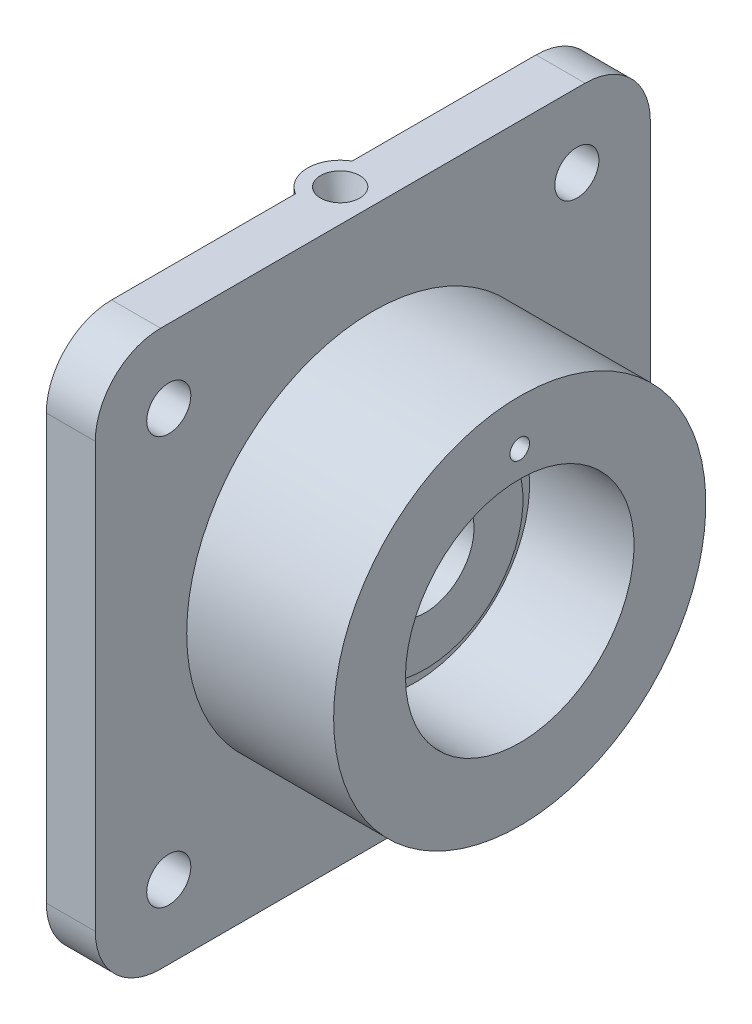
ISO-10303-21;
HEADER;
FILE_DESCRIPTION(('STEP AP214'),'2;1');
FILE_NAME('part.step','',(''),(''),'','','');
FILE_SCHEMA(('AUTOMOTIVE_DESIGN { 1 0 10303 214 1 1 1 1 }'));
ENDSEC;
DATA;
#1=APPLICATION_CONTEXT('core data for automotive mechanical design processes');
#2=APPLICATION_PROTOCOL_DEFINITION('international standard','automotive_design',2000,#1);
#3=PRODUCT_CONTEXT('',#1,'mechanical');
#4=PRODUCT('Part','Part','',(#3));
#5=PRODUCT_RELATED_PRODUCT_CATEGORY('part','',(#4));
#6=PRODUCT_DEFINITION_FORMATION('','',#4);
#7=PRODUCT_DEFINITION_CONTEXT('part definition',#1,'design');
#8=PRODUCT_DEFINITION('design','',#6,#7);
#9=PRODUCT_DEFINITION_SHAPE('','',#8);
#10=(LENGTH_UNIT() NAMED_UNIT(*) SI_UNIT(.MILLI.,.METRE.));
#11=(NAMED_UNIT(*) PLANE_ANGLE_UNIT() SI_UNIT($,.RADIAN.));
#12=(NAMED_UNIT(*) SI_UNIT($,.STERADIAN.) SOLID_ANGLE_UNIT());
#13=UNCERTAINTY_MEASURE_WITH_UNIT(LENGTH_MEASURE(1.E-05),#10,'distance_accuracy_value','');
#14=(GEOMETRIC_REPRESENTATION_CONTEXT(3) GLOBAL_UNCERTAINTY_ASSIGNED_CONTEXT((#13)) GLOBAL_UNIT_ASSIGNED_CONTEXT((#10,
#11,#12)) REPRESENTATION_CONTEXT('',''));
#15=CARTESIAN_POINT('',(0.,0.,0.));
#16=DIRECTION('',(0.,0.,1.));
#17=DIRECTION('',(1.,0.,0.));
#18=AXIS2_PLACEMENT_3D('',#15,#16,#17);
#19=CARTESIAN_POINT('',(-987.033440026019,1.72299642004541E-13,8.72654559075154E-13));
#20=DIRECTION('',(-1.,0.,0.));
#21=DIRECTION('',(0.,0.,1.));
#22=AXIS2_PLACEMENT_3D('',#19,#20,#21);
#23=CYLINDRICAL_SURFACE('',#22,15.);
#24=CARTESIAN_POINT('',(0.,0.,0.));
#25=DIRECTION('',(-1.,0.,0.));
#26=DIRECTION('',(0.,0.,1.));
#27=AXIS2_PLACEMENT_3D('',#24,#25,#26);
#28=CIRCLE('',#27,15.);
#29=CARTESIAN_POINT('',(0.,0.,15.));
#30=VERTEX_POINT('',#29);
#31=EDGE_CURVE('E58',#30,#30,#28,.T.);
#32=ORIENTED_EDGE('',*,*,#31,.T.);
#33=EDGE_LOOP('',(#32));
#34=FACE_BOUND('',#33,.T.);
#35=CARTESIAN_POINT('',(24.,0.,0.));
#36=DIRECTION('',(-1.,0.,0.));
#37=DIRECTION('',(0.,0.,1.));
#38=AXIS2_PLACEMENT_3D('',#35,#36,#37);
#39=CIRCLE('',#38,15.);
#40=CARTESIAN_POINT('',(24.,0.,15.));
#41=VERTEX_POINT('',#40);
#42=EDGE_CURVE('E260',#41,#41,#39,.T.);
#43=ORIENTED_EDGE('',*,*,#42,.F.);
#44=EDGE_LOOP('',(#43));
#45=FACE_BOUND('',#44,.T.);
#46=ADVANCED_FACE('F48',(#34,#45),#23,.F.);
#47=CARTESIAN_POINT('',(0.,-15.0000000000002,0.));
#48=DIRECTION('',(-1.,0.,0.));
#49=DIRECTION('',(0.,0.,1.));
#50=AXIS2_PLACEMENT_3D('',#47,#48,#49);
#51=PLANE('',#50);
#52=CARTESIAN_POINT('',(0.,0.,0.));
#53=DIRECTION('',(-1.,0.,0.));
#54=DIRECTION('',(0.,0.,1.));
#55=AXIS2_PLACEMENT_3D('',#52,#53,#54);
#56=CIRCLE('',#55,25.);
#57=CARTESIAN_POINT('',(0.,0.,25.));
#58=VERTEX_POINT('',#57);
#59=EDGE_CURVE('E220',#58,#58,#56,.T.);
#60=ORIENTED_EDGE('',*,*,#59,.T.);
#61=EDGE_LOOP('',(#60));
#62=FACE_BOUND('',#61,.T.);
#63=ORIENTED_EDGE('',*,*,#31,.F.);
#64=EDGE_LOOP('',(#63));
#65=FACE_BOUND('',#64,.T.);
#66=ADVANCED_FACE('F249',(#62,#65),#51,.T.);
#67=CARTESIAN_POINT('',(0.,0.,0.));
#68=DIRECTION('',(1.,0.,0.));
#69=DIRECTION('',(0.,0.,-1.));
#70=AXIS2_PLACEMENT_3D('',#67,#68,#69);
#71=CONICAL_SURFACE('',#70,25.,0.174532925199433);
#72=CARTESIAN_POINT('',(20.0002,27.1802037225528,8.66036950481912));
#73=CARTESIAN_POINT('',(19.7583612049618,27.1799140194188,8.52079028714546));
#74=CARTESIAN_POINT('',(19.5224276334431,27.1830009187761,8.3710397261757));
#75=CARTESIAN_POINT('',(19.0640460400013,27.1947924607177,8.05246224185927));
#76=CARTESIAN_POINT('',(18.8415945167083,27.2034956378223,7.88364030436682));
#77=CARTESIAN_POINT('',(18.4120003507702,27.2253712476694,7.52834062560167));
#78=CARTESIAN_POINT('',(18.204838411896,27.238537925597,7.34188584053183));
#79=CARTESIAN_POINT('',(17.8069002647715,27.2681227004214,6.95246777022012));
#80=CARTESIAN_POINT('',(17.616124814811,27.2845409476695,6.74950372185222));
#81=CARTESIAN_POINT('',(17.2523079524373,27.3193947758621,6.32855703223281));
#82=CARTESIAN_POINT('',(17.0792600037938,27.3378296080586,6.11057997629617));
#83=CARTESIAN_POINT('',(16.7519555301652,27.375520437981,5.66101332668143));
#84=CARTESIAN_POINT('',(16.5976991240781,27.3947764409016,5.4294236468872));
#85=CARTESIAN_POINT('',(16.3089978616752,27.4329719420888,4.9541687980824));
#86=CARTESIAN_POINT('',(16.1745538708315,27.4519114264967,4.71050310217231));
#87=CARTESIAN_POINT('',(15.9263995459613,27.4884278399907,4.21273237674332));
#88=CARTESIAN_POINT('',(15.8126893304333,27.506004761289,3.95862728757097));
#89=CARTESIAN_POINT('',(15.6054745466998,27.5390839263729,3.43835717044958));
#90=CARTESIAN_POINT('',(15.5122492949014,27.5545565101361,3.17207891655079));
#91=CARTESIAN_POINT('',(15.3485886014455,27.582349058389,2.63244293887205));
#92=CARTESIAN_POINT('',(15.27815337117,27.5946689936371,2.35908514945337));
#93=CARTESIAN_POINT('',(15.1606199054531,27.6155282400506,1.8072572605889));
#94=CARTESIAN_POINT('',(15.1135213285414,27.6240676065345,1.528787236009));
#95=CARTESIAN_POINT('',(15.0430358788196,27.6369366265367,0.968767194897736));
#96=CARTESIAN_POINT('',(15.0196486478036,27.6412663436498,0.68721722495986));
#97=CARTESIAN_POINT('',(14.9969314313763,27.6454715528239,0.126996059552903));
#98=CARTESIAN_POINT('',(14.9972751193887,27.6454074646893,-0.151661496604394));
#99=CARTESIAN_POINT('',(15.0212063137843,27.6409785161866,-0.707940599462251));
#100=CARTESIAN_POINT('',(15.0447936376456,27.6366136895903,-0.985562154280883));
#101=CARTESIAN_POINT('',(15.1150217576745,27.6237957632798,-1.53774417934562));
#102=CARTESIAN_POINT('',(15.1616599444806,27.6153431263087,-1.81230499247174));
#103=CARTESIAN_POINT('',(15.277627200125,27.5947629103857,-2.35644932852276));
#104=CARTESIAN_POINT('',(15.3469562766689,27.5826353301857,-2.62603284975733));
#105=CARTESIAN_POINT('',(15.507424694026,27.5553671263929,-3.15715601917341));
#106=CARTESIAN_POINT('',(15.5984656595696,27.5402401435831,-3.41872611074714));
#107=CARTESIAN_POINT('',(15.8018626600679,27.5076991446353,-3.9332949299422));
#108=CARTESIAN_POINT('',(15.9142188055559,27.4902851166378,-4.18629361310714));
#109=CARTESIAN_POINT('',(16.1595365742084,27.4540632203677,-4.68217603193833));
#110=CARTESIAN_POINT('',(16.292510294493,27.4352545371999,-4.92505372239825));
#111=CARTESIAN_POINT('',(16.5781148646327,27.397278262865,-5.39892407498215));
#112=CARTESIAN_POINT('',(16.7307453009989,27.3781106792547,-5.62991698696538));
#113=CARTESIAN_POINT('',(17.0574101833492,27.3402151764044,-6.08230395427542));
#114=CARTESIAN_POINT('',(17.2317637057789,27.3215002250707,-6.3034688049482));
#115=CARTESIAN_POINT('',(17.5985873491704,27.2860973375485,-6.73040057003544));
#116=CARTESIAN_POINT('',(17.7910571301085,27.2694093633292,-6.93616777331797));
#117=CARTESIAN_POINT('',(18.1924488094293,27.2393577051237,-7.33050298248633));
#118=CARTESIAN_POINT('',(18.4013415764681,27.2259883022894,-7.51910021683716));
#119=CARTESIAN_POINT('',(18.8343350810547,27.2037941014571,-7.87804398835469));
#120=CARTESIAN_POINT('',(19.058426808163,27.1949666370468,-8.04840118697615));
#121=CARTESIAN_POINT('',(19.4046029993811,27.1860173721043,-8.28922697893606));
#122=CARTESIAN_POINT('',(19.521604442444,27.1837496716477,-8.36701378373048));
#123=CARTESIAN_POINT('',(19.7586422615841,27.1807758447107,-8.51750247572069));
#124=CARTESIAN_POINT('',(19.8786745690405,27.1800677267653,-8.59021073275157));
#125=CARTESIAN_POINT('',(20.0002,27.1802037225528,-8.66036950481912));
#126=B_SPLINE_CURVE_WITH_KNOTS('',3,(#72,#73,#74,#75,#76,#77,#78,#79,#80,#81,#82,#83,#84,#85,
#86,#87,#88,#89,#90,#91,#92,#93,#94,#95,#96,#97,#98,#99,#100,#101,#102,#103,#104,#105,#106,#107,
#108,#109,#110,#111,#112,#113,#114,#115,#116,#117,#118,#119,#120,#121,#122,#123,#124,#125),
.UNSPECIFIED.,.F.,.F.,(4,2,2,2,2,2,2,2,2,2,2,2,2,2,2,2,2,2,2,2,2,2,2,2,2,2,4),(0.,
0.8373720693448,1.6745257278613,2.51060411911165,3.34672117932951,4.18252884042138,
5.01834178956477,5.85419123897557,6.6900454653154,7.53667285634412,8.38330809978949,
9.22993095459842,10.0765410193364,10.9115116023186,11.7464756287013,12.5813451586656,
13.4162149721503,14.2473715989325,15.0785325359241,15.9101830052918,16.7418159833338,
17.5875517810954,18.4332717084231,19.2775239390652,20.1212799717719,20.5427180191819,
20.9636176103624),.UNSPECIFIED.);
#127=CARTESIAN_POINT('',(20.,27.1802035010555,8.66025403784444));
#128=VERTEX_POINT('',#127);
#129=CARTESIAN_POINT('',(20.,27.1802035010555,-8.66025403784444));
#130=VERTEX_POINT('',#129);
#131=EDGE_CURVE('E65',#128,#130,#126,.T.);
#132=ORIENTED_EDGE('',*,*,#131,.T.);
#133=CARTESIAN_POINT('',(20.,0.,0.));
#134=DIRECTION('',(-1.,0.,0.));
#135=DIRECTION('',(0.,0.,1.));
#136=AXIS2_PLACEMENT_3D('',#133,#134,#135);
#137=CIRCLE('',#136,28.5265396141693);
#138=EDGE_CURVE('E145',#130,#128,#137,.T.);
#139=ORIENTED_EDGE('',*,*,#138,.T.);
#140=EDGE_LOOP('',(#132,#139));
#141=FACE_BOUND('',#140,.T.);
#142=ORIENTED_EDGE('',*,*,#59,.F.);
#143=EDGE_LOOP('',(#142));
#144=FACE_BOUND('',#143,.T.);
#145=ADVANCED_FACE('F254',(#141,#144),#71,.T.);
#146=CARTESIAN_POINT('',(20.,-28.5265396141697,0.));
#147=DIRECTION('',(-1.,0.,0.));
#148=DIRECTION('',(0.,0.,1.));
#149=AXIS2_PLACEMENT_3D('',#146,#147,#148);
#150=PLANE('',#149);
#151=DIRECTION('',(0.,1.00000000000001,0.));
#152=VECTOR('',#151,1.);
#153=CARTESIAN_POINT('',(20.0000000000874,-500000.000000006,8.66025403790949));
#154=LINE('',#153,#152);
#155=CARTESIAN_POINT('',(20.,84.9999999999802,8.66025403784444));
#156=VERTEX_POINT('',#155);
#157=EDGE_CURVE('E72',#156,#128,#154,.F.);
#158=ORIENTED_EDGE('',*,*,#157,.T.);
#159=ORIENTED_EDGE('',*,*,#138,.F.);
#160=DIRECTION('',(0.,1.00000000000001,0.));
#161=VECTOR('',#160,1.);
#162=CARTESIAN_POINT('',(20.0000000000874,-500000.000000006,-8.66025403777939));
#163=LINE('',#162,#161);
#164=CARTESIAN_POINT('',(20.,85.0000000000007,-8.66025403784444));
#165=VERTEX_POINT('',#164);
#166=EDGE_CURVE('E142',#130,#165,#163,.T.);
#167=ORIENTED_EDGE('',*,*,#166,.T.);
#168=DIRECTION('',(0.,0.,-1.));
#169=VECTOR('',#168,1.);
#170=CARTESIAN_POINT('',(20.,85.0000000000007,-64.9999999999999));
#171=LINE('',#170,#169);
#172=CARTESIAN_POINT('',(20.,85.0000000000007,-64.9999999999999));
#173=VERTEX_POINT('',#172);
#174=EDGE_CURVE('E128',#165,#173,#171,.T.);
#175=ORIENTED_EDGE('',*,*,#174,.T.);
#176=CARTESIAN_POINT('',(20.,65.0000000000007,-65.));
#177=DIRECTION('',(-1.,0.,0.));
#178=DIRECTION('',(0.,0.,1.));
#179=AXIS2_PLACEMENT_3D('',#176,#177,#178);
#180=CIRCLE('',#179,20.);
#181=CARTESIAN_POINT('',(20.,65.0000000000006,-85.));
#182=VERTEX_POINT('',#181);
#183=EDGE_CURVE('E606',#173,#182,#180,.T.);
#184=ORIENTED_EDGE('',*,*,#183,.T.);
#185=DIRECTION('',(0.,-1.00000000000001,0.));
#186=VECTOR('',#185,1.);
#187=CARTESIAN_POINT('',(20.,-65.0000000000006,-85.));
#188=LINE('',#187,#186);
#189=CARTESIAN_POINT('',(20.,-65.0000000000006,-85.));
#190=VERTEX_POINT('',#189);
#191=EDGE_CURVE('E572',#182,#190,#188,.T.);
#192=ORIENTED_EDGE('',*,*,#191,.T.);
#193=CARTESIAN_POINT('',(20.,-65.0000000000007,-65.));
#194=DIRECTION('',(-1.,0.,0.));
#195=DIRECTION('',(0.,0.,-1.));
#196=AXIS2_PLACEMENT_3D('',#193,#194,#195);
#197=CIRCLE('',#196,20.);
#198=CARTESIAN_POINT('',(20.,-85.0000000000007,-64.9999999999999));
#199=VERTEX_POINT('',#198);
#200=EDGE_CURVE('E562',#190,#199,#197,.T.);
#201=ORIENTED_EDGE('',*,*,#200,.T.);
#202=DIRECTION('',(0.,0.,1.));
#203=VECTOR('',#202,1.);
#204=CARTESIAN_POINT('',(20.,-85.0000000000007,-64.9999999999999));
#205=LINE('',#204,#203);
#206=CARTESIAN_POINT('',(20.,-85.0000000000007,64.9999999999999));
#207=VERTEX_POINT('',#206);
#208=EDGE_CURVE('E595',#199,#207,#205,.T.);
#209=ORIENTED_EDGE('',*,*,#208,.T.);
#210=CARTESIAN_POINT('',(20.,-65.0000000000007,65.));
#211=DIRECTION('',(-1.,0.,0.));
#212=DIRECTION('',(0.,0.,-1.));
#213=AXIS2_PLACEMENT_3D('',#210,#211,#212);
#214=CIRCLE('',#213,20.);
#215=CARTESIAN_POINT('',(20.,-65.0000000000006,85.));
#216=VERTEX_POINT('',#215);
#217=EDGE_CURVE('E598',#207,#216,#214,.T.);
#218=ORIENTED_EDGE('',*,*,#217,.T.);
#219=DIRECTION('',(0.,1.00000000000001,0.));
#220=VECTOR('',#219,1.);
#221=CARTESIAN_POINT('',(20.,-65.0000000000006,85.));
#222=LINE('',#221,#220);
#223=CARTESIAN_POINT('',(20.,65.0000000000005,85.));
#224=VERTEX_POINT('',#223);
#225=EDGE_CURVE('E601',#216,#224,#222,.T.);
#226=ORIENTED_EDGE('',*,*,#225,.T.);
#227=CARTESIAN_POINT('',(20.,65.0000000000007,65.));
#228=DIRECTION('',(-1.,0.,0.));
#229=DIRECTION('',(0.,0.,-1.));
#230=AXIS2_PLACEMENT_3D('',#227,#228,#229);
#231=CIRCLE('',#230,20.);
#232=CARTESIAN_POINT('',(20.,85.0000000000007,64.9999999999999));
#233=VERTEX_POINT('',#232);
#234=EDGE_CURVE('E139',#224,#233,#231,.T.);
#235=ORIENTED_EDGE('',*,*,#234,.T.);
#236=EDGE_CURVE('E138',#233,#156,#171,.T.);
#237=ORIENTED_EDGE('',*,*,#236,.T.);
#238=EDGE_LOOP('',(#158,#159,#167,#175,#184,#192,#201,#209,#218,#226,#235,#237));
#239=FACE_BOUND('',#238,.T.);
#240=CARTESIAN_POINT('',(20.,-62.5000000000007,62.5));
#241=DIRECTION('',(-1.,0.,0.));
#242=DIRECTION('',(0.,0.,1.));
#243=AXIS2_PLACEMENT_3D('',#240,#241,#242);
#244=CIRCLE('',#243,6.75);
#245=CARTESIAN_POINT('',(20.,-62.5000000000007,69.25));
#246=VERTEX_POINT('',#245);
#247=EDGE_CURVE('E149',#246,#246,#244,.T.);
#248=ORIENTED_EDGE('',*,*,#247,.F.);
#249=EDGE_LOOP('',(#248));
#250=FACE_BOUND('',#249,.T.);
#251=CARTESIAN_POINT('',(20.,62.5000000000007,62.5));
#252=DIRECTION('',(-1.,0.,0.));
#253=DIRECTION('',(0.,0.,1.));
#254=AXIS2_PLACEMENT_3D('',#251,#252,#253);
#255=CIRCLE('',#254,6.75);
#256=CARTESIAN_POINT('',(20.,62.5000000000007,69.25));
#257=VERTEX_POINT('',#256);
#258=EDGE_CURVE('E549',#257,#257,#255,.T.);
#259=ORIENTED_EDGE('',*,*,#258,.F.);
#260=EDGE_LOOP('',(#259));
#261=FACE_BOUND('',#260,.T.);
#262=CARTESIAN_POINT('',(20.,62.5000000000007,-62.5));
#263=DIRECTION('',(-1.,0.,0.));
#264=DIRECTION('',(0.,0.,1.));
#265=AXIS2_PLACEMENT_3D('',#262,#263,#264);
#266=CIRCLE('',#265,6.75);
#267=CARTESIAN_POINT('',(20.,62.5000000000007,-55.75));
#268=VERTEX_POINT('',#267);
#269=EDGE_CURVE('E553',#268,#268,#266,.T.);
#270=ORIENTED_EDGE('',*,*,#269,.F.);
#271=EDGE_LOOP('',(#270));
#272=FACE_BOUND('',#271,.T.);
#273=CARTESIAN_POINT('',(20.,-62.5000000000007,-62.5));
#274=DIRECTION('',(-1.,0.,0.));
#275=DIRECTION('',(0.,0.,1.));
#276=AXIS2_PLACEMENT_3D('',#273,#274,#275);
#277=CIRCLE('',#276,6.75);
#278=CARTESIAN_POINT('',(20.,-62.5000000000007,-55.75));
#279=VERTEX_POINT('',#278);
#280=EDGE_CURVE('E556',#279,#279,#277,.T.);
#281=ORIENTED_EDGE('',*,*,#280,.F.);
#282=EDGE_LOOP('',(#281));
#283=FACE_BOUND('',#282,.T.);
#284=ADVANCED_FACE('F143',(#239,#250,#261,#272,#283),#150,.T.);
#285=CARTESIAN_POINT('',(-987.033440026019,1.72299642004541E-13,8.72654559075154E-13));
#286=DIRECTION('',(-1.,0.,0.));
#287=DIRECTION('',(0.,0.,1.));
#288=AXIS2_PLACEMENT_3D('',#285,#286,#287);
#289=CYLINDRICAL_SURFACE('',#288,57.);
#290=CARTESIAN_POINT('',(34.9999999999999,0.,0.));
#291=DIRECTION('',(1.,0.,0.));
#292=DIRECTION('',(0.,0.,-1.));
#293=AXIS2_PLACEMENT_3D('',#290,#291,#292);
#294=CIRCLE('',#293,57.);
#295=CARTESIAN_POINT('',(35.,0.,-57.));
#296=VERTEX_POINT('',#295);
#297=EDGE_CURVE('E14',#296,#296,#294,.F.);
#298=ORIENTED_EDGE('',*,*,#297,.F.);
#299=EDGE_LOOP('',(#298));
#300=FACE_BOUND('',#299,.T.);
#301=CARTESIAN_POINT('',(80.0000000000001,0.,0.));
#302=DIRECTION('',(-1.,0.,0.));
#303=DIRECTION('',(0.,0.,1.));
#304=AXIS2_PLACEMENT_3D('',#301,#302,#303);
#305=CIRCLE('',#304,57.);
#306=CARTESIAN_POINT('',(80.,0.,56.9999999999999));
#307=VERTEX_POINT('',#306);
#308=EDGE_CURVE('E217',#307,#307,#305,.T.);
#309=ORIENTED_EDGE('',*,*,#308,.T.);
#310=EDGE_LOOP('',(#309));
#311=FACE_BOUND('',#310,.T.);
#312=ADVANCED_FACE('F209',(#300,#311),#289,.T.);
#313=CARTESIAN_POINT('',(80.,-57.0000000000007,0.));
#314=DIRECTION('',(1.,0.,0.));
#315=DIRECTION('',(0.,0.,-1.));
#316=AXIS2_PLACEMENT_3D('',#313,#314,#315);
#317=PLANE('',#316);
#318=CARTESIAN_POINT('',(80.,43.0000000000003,0.));
#319=DIRECTION('',(1.,0.,0.));
#320=DIRECTION('',(0.,0.,-1.));
#321=AXIS2_PLACEMENT_3D('',#318,#319,#320);
#322=CIRCLE('',#321,3.);
#323=CARTESIAN_POINT('',(80.,43.0000000000003,-3.00000000000008));
#324=VERTEX_POINT('',#323);
#325=EDGE_CURVE('E199',#324,#324,#322,.T.);
#326=ORIENTED_EDGE('',*,*,#325,.F.);
#327=EDGE_LOOP('',(#326));
#328=FACE_BOUND('',#327,.T.);
#329=CARTESIAN_POINT('',(80.0000000000001,0.,0.));
#330=DIRECTION('',(-1.,0.,0.));
#331=DIRECTION('',(0.,0.,1.));
#332=AXIS2_PLACEMENT_3D('',#329,#330,#331);
#333=CIRCLE('',#332,35.);
#334=CARTESIAN_POINT('',(80.,0.,34.9999999999999));
#335=VERTEX_POINT('',#334);
#336=EDGE_CURVE('E214',#335,#335,#333,.T.);
#337=ORIENTED_EDGE('',*,*,#336,.T.);
#338=EDGE_LOOP('',(#337));
#339=FACE_BOUND('',#338,.T.);
#340=ORIENTED_EDGE('',*,*,#308,.F.);
#341=EDGE_LOOP('',(#340));
#342=FACE_BOUND('',#341,.T.);
#343=ADVANCED_FACE('F205',(#328,#339,#342),#317,.T.);
#344=CARTESIAN_POINT('',(-987.033440026019,1.72299642004541E-13,8.72654559075154E-13));
#345=DIRECTION('',(-1.,0.,0.));
#346=DIRECTION('',(0.,0.,1.));
#347=AXIS2_PLACEMENT_3D('',#344,#345,#346);
#348=CYLINDRICAL_SURFACE('',#347,35.);
#349=CARTESIAN_POINT('',(48.,0.,0.));
#350=DIRECTION('',(-1.,0.,0.));
#351=DIRECTION('',(0.,0.,1.));
#352=AXIS2_PLACEMENT_3D('',#349,#350,#351);
#353=CIRCLE('',#352,35.);
#354=CARTESIAN_POINT('',(48.,0.,35.));
#355=VERTEX_POINT('',#354);
#356=EDGE_CURVE('E222',#355,#355,#353,.T.);
#357=ORIENTED_EDGE('',*,*,#356,.T.);
#358=EDGE_LOOP('',(#357));
#359=FACE_BOUND('',#358,.T.);
#360=ORIENTED_EDGE('',*,*,#336,.F.);
#361=EDGE_LOOP('',(#360));
#362=FACE_BOUND('',#361,.T.);
#363=ADVANCED_FACE('F208',(#359,#362),#348,.F.);
#364=CARTESIAN_POINT('',(48.,-35.0000000000004,0.));
#365=DIRECTION('',(1.,0.,0.));
#366=DIRECTION('',(0.,0.,-1.));
#367=AXIS2_PLACEMENT_3D('',#364,#365,#366);
#368=PLANE('',#367);
#369=CARTESIAN_POINT('',(48.,0.,0.));
#370=DIRECTION('',(-1.,0.,0.));
#371=DIRECTION('',(0.,0.,1.));
#372=AXIS2_PLACEMENT_3D('',#369,#370,#371);
#373=CIRCLE('',#372,30.);
#374=CARTESIAN_POINT('',(48.,0.,30.));
#375=VERTEX_POINT('',#374);
#376=EDGE_CURVE('E295',#375,#375,#373,.T.);
#377=ORIENTED_EDGE('',*,*,#376,.T.);
#378=EDGE_LOOP('',(#377));
#379=FACE_BOUND('',#378,.T.);
#380=ORIENTED_EDGE('',*,*,#356,.F.);
#381=EDGE_LOOP('',(#380));
#382=FACE_BOUND('',#381,.T.);
#383=ADVANCED_FACE('F302',(#379,#382),#368,.T.);
#384=CARTESIAN_POINT('',(-987.033440026019,1.72299642004541E-13,8.72654559075154E-13));
#385=DIRECTION('',(-1.,0.,0.));
#386=DIRECTION('',(0.,0.,1.));
#387=AXIS2_PLACEMENT_3D('',#384,#385,#386);
#388=CYLINDRICAL_SURFACE('',#387,30.);
#389=CARTESIAN_POINT('',(50.9999999999999,0.,0.));
#390=DIRECTION('',(-1.,0.,0.));
#391=DIRECTION('',(0.,0.,1.));
#392=AXIS2_PLACEMENT_3D('',#389,#390,#391);
#393=CIRCLE('',#392,30.);
#394=CARTESIAN_POINT('',(50.9999999999999,0.,30.));
#395=VERTEX_POINT('',#394);
#396=EDGE_CURVE('E292',#395,#395,#393,.T.);
#397=ORIENTED_EDGE('',*,*,#396,.T.);
#398=EDGE_LOOP('',(#397));
#399=FACE_BOUND('',#398,.T.);
#400=ORIENTED_EDGE('',*,*,#376,.F.);
#401=EDGE_LOOP('',(#400));
#402=FACE_BOUND('',#401,.T.);
#403=ADVANCED_FACE('F304',(#399,#402),#388,.T.);
#404=CARTESIAN_POINT('',(51.,-30.0000000000003,0.));
#405=DIRECTION('',(1.,0.,0.));
#406=DIRECTION('',(0.,0.,-1.));
#407=AXIS2_PLACEMENT_3D('',#404,#405,#406);
#408=PLANE('',#407);
#409=CARTESIAN_POINT('',(50.9999999999999,0.,0.));
#410=DIRECTION('',(-1.,0.,0.));
#411=DIRECTION('',(0.,0.,1.));
#412=AXIS2_PLACEMENT_3D('',#409,#410,#411);
#413=CIRCLE('',#412,15.);
#414=CARTESIAN_POINT('',(50.9999999999999,0.,14.9999999999999));
#415=VERTEX_POINT('',#414);
#416=EDGE_CURVE('E289',#415,#415,#413,.T.);
#417=ORIENTED_EDGE('',*,*,#416,.T.);
#418=EDGE_LOOP('',(#417));
#419=FACE_BOUND('',#418,.T.);
#420=ORIENTED_EDGE('',*,*,#396,.F.);
#421=EDGE_LOOP('',(#420));
#422=FACE_BOUND('',#421,.T.);
#423=ADVANCED_FACE('F311',(#419,#422),#408,.T.);
#424=CARTESIAN_POINT('',(-987.033440026019,1.72299642004541E-13,8.72654559075154E-13));
#425=DIRECTION('',(-1.,0.,0.));
#426=DIRECTION('',(0.,0.,1.));
#427=AXIS2_PLACEMENT_3D('',#424,#425,#426);
#428=CYLINDRICAL_SURFACE('',#427,15.);
#429=CARTESIAN_POINT('',(38.9999999999999,0.,0.));
#430=DIRECTION('',(-1.,0.,0.));
#431=DIRECTION('',(0.,0.,1.));
#432=AXIS2_PLACEMENT_3D('',#429,#430,#431);
#433=CIRCLE('',#432,15.);
#434=CARTESIAN_POINT('',(38.9999999999999,0.,15.));
#435=VERTEX_POINT('',#434);
#436=EDGE_CURVE('E286',#435,#435,#433,.T.);
#437=ORIENTED_EDGE('',*,*,#436,.T.);
#438=EDGE_LOOP('',(#437));
#439=FACE_BOUND('',#438,.T.);
#440=ORIENTED_EDGE('',*,*,#416,.F.);
#441=EDGE_LOOP('',(#440));
#442=FACE_BOUND('',#441,.T.);
#443=ADVANCED_FACE('F362',(#439,#442),#428,.F.);
#444=CARTESIAN_POINT('',(39.,-15.0000000000002,0.));
#445=DIRECTION('',(-1.,0.,0.));
#446=DIRECTION('',(0.,0.,1.));
#447=AXIS2_PLACEMENT_3D('',#444,#445,#446);
#448=PLANE('',#447);
#449=CARTESIAN_POINT('',(38.9999999999999,0.,0.));
#450=DIRECTION('',(-1.,0.,0.));
#451=DIRECTION('',(0.,0.,1.));
#452=AXIS2_PLACEMENT_3D('',#449,#450,#451);
#453=CIRCLE('',#452,20.);
#454=CARTESIAN_POINT('',(38.9999999999999,0.,20.));
#455=VERTEX_POINT('',#454);
#456=EDGE_CURVE('E283',#455,#455,#453,.T.);
#457=ORIENTED_EDGE('',*,*,#456,.T.);
#458=EDGE_LOOP('',(#457));
#459=FACE_BOUND('',#458,.T.);
#460=ORIENTED_EDGE('',*,*,#436,.F.);
#461=EDGE_LOOP('',(#460));
#462=FACE_BOUND('',#461,.T.);
#463=ADVANCED_FACE('F369',(#459,#462),#448,.T.);
#464=CARTESIAN_POINT('',(-987.033440026019,1.72299642004541E-13,8.72654559075154E-13));
#465=DIRECTION('',(-1.,0.,0.));
#466=DIRECTION('',(0.,0.,1.));
#467=AXIS2_PLACEMENT_3D('',#464,#465,#466);
#468=CYLINDRICAL_SURFACE('',#467,20.);
#469=ORIENTED_EDGE('',*,*,#456,.F.);
#470=EDGE_LOOP('',(#469));
#471=FACE_BOUND('',#470,.T.);
#472=CARTESIAN_POINT('',(34.,0.,0.));
#473=DIRECTION('',(-1.,0.,0.));
#474=DIRECTION('',(0.,0.,1.));
#475=AXIS2_PLACEMENT_3D('',#472,#473,#474);
#476=CIRCLE('',#475,20.);
#477=CARTESIAN_POINT('',(34.,0.,20.));
#478=VERTEX_POINT('',#477);
#479=EDGE_CURVE('E280',#478,#478,#476,.T.);
#480=ORIENTED_EDGE('',*,*,#479,.T.);
#481=EDGE_LOOP('',(#480));
#482=FACE_BOUND('',#481,.T.);
#483=ADVANCED_FACE('F377',(#471,#482),#468,.F.);
#484=CARTESIAN_POINT('',(34.,-20.0000000000002,0.));
#485=DIRECTION('',(1.,0.,0.));
#486=DIRECTION('',(0.,0.,-1.));
#487=AXIS2_PLACEMENT_3D('',#484,#485,#486);
#488=PLANE('',#487);
#489=CARTESIAN_POINT('',(34.,0.,0.));
#490=DIRECTION('',(-1.,0.,0.));
#491=DIRECTION('',(0.,0.,1.));
#492=AXIS2_PLACEMENT_3D('',#489,#490,#491);
#493=CIRCLE('',#492,15.);
#494=CARTESIAN_POINT('',(34.,0.,15.));
#495=VERTEX_POINT('',#494);
#496=EDGE_CURVE('E277',#495,#495,#493,.T.);
#497=ORIENTED_EDGE('',*,*,#496,.T.);
#498=EDGE_LOOP('',(#497));
#499=FACE_BOUND('',#498,.T.);
#500=ORIENTED_EDGE('',*,*,#479,.F.);
#501=EDGE_LOOP('',(#500));
#502=FACE_BOUND('',#501,.T.);
#503=ADVANCED_FACE('F385',(#499,#502),#488,.T.);
#504=CARTESIAN_POINT('',(-987.033440026019,1.72299642004541E-13,8.72654559075154E-13));
#505=DIRECTION('',(-1.,0.,0.));
#506=DIRECTION('',(0.,0.,1.));
#507=AXIS2_PLACEMENT_3D('',#504,#505,#506);
#508=CYLINDRICAL_SURFACE('',#507,15.);
#509=CARTESIAN_POINT('',(28.9999999999999,0.,0.));
#510=DIRECTION('',(-1.,0.,0.));
#511=DIRECTION('',(0.,0.,1.));
#512=AXIS2_PLACEMENT_3D('',#509,#510,#511);
#513=CIRCLE('',#512,15.);
#514=CARTESIAN_POINT('',(28.9999999999999,0.,15.));
#515=VERTEX_POINT('',#514);
#516=EDGE_CURVE('E274',#515,#515,#513,.T.);
#517=ORIENTED_EDGE('',*,*,#516,.T.);
#518=EDGE_LOOP('',(#517));
#519=FACE_BOUND('',#518,.T.);
#520=ORIENTED_EDGE('',*,*,#496,.F.);
#521=EDGE_LOOP('',(#520));
#522=FACE_BOUND('',#521,.T.);
#523=ADVANCED_FACE('F393',(#519,#522),#508,.F.);
#524=CARTESIAN_POINT('',(29.,-15.0000000000002,0.));
#525=DIRECTION('',(-1.,0.,0.));
#526=DIRECTION('',(0.,0.,1.));
#527=AXIS2_PLACEMENT_3D('',#524,#525,#526);
#528=PLANE('',#527);
#529=CARTESIAN_POINT('',(28.9999999999999,0.,0.));
#530=DIRECTION('',(-1.,0.,0.));
#531=DIRECTION('',(0.,0.,1.));
#532=AXIS2_PLACEMENT_3D('',#529,#530,#531);
#533=CIRCLE('',#532,20.);
#534=CARTESIAN_POINT('',(28.9999999999999,0.,20.));
#535=VERTEX_POINT('',#534);
#536=EDGE_CURVE('E266',#535,#535,#533,.T.);
#537=ORIENTED_EDGE('',*,*,#536,.T.);
#538=EDGE_LOOP('',(#537));
#539=FACE_BOUND('',#538,.T.);
#540=ORIENTED_EDGE('',*,*,#516,.F.);
#541=EDGE_LOOP('',(#540));
#542=FACE_BOUND('',#541,.T.);
#543=ADVANCED_FACE('F401',(#539,#542),#528,.T.);
#544=CARTESIAN_POINT('',(-987.033440026019,1.72299642004541E-13,8.72654559075154E-13));
#545=DIRECTION('',(-1.,0.,0.));
#546=DIRECTION('',(0.,0.,1.));
#547=AXIS2_PLACEMENT_3D('',#544,#545,#546);
#548=CYLINDRICAL_SURFACE('',#547,20.);
#549=CARTESIAN_POINT('',(24.,0.,0.));
#550=DIRECTION('',(-1.,0.,0.));
#551=DIRECTION('',(0.,0.,1.));
#552=AXIS2_PLACEMENT_3D('',#549,#550,#551);
#553=CIRCLE('',#552,20.);
#554=CARTESIAN_POINT('',(24.,0.,20.));
#555=VERTEX_POINT('',#554);
#556=EDGE_CURVE('E262',#555,#555,#553,.T.);
#557=ORIENTED_EDGE('',*,*,#556,.T.);
#558=EDGE_LOOP('',(#557));
#559=FACE_BOUND('',#558,.T.);
#560=ORIENTED_EDGE('',*,*,#536,.F.);
#561=EDGE_LOOP('',(#560));
#562=FACE_BOUND('',#561,.T.);
#563=ADVANCED_FACE('F409',(#559,#562),#548,.F.);
#564=CARTESIAN_POINT('',(24.,-20.0000000000002,0.));
#565=DIRECTION('',(1.,0.,0.));
#566=DIRECTION('',(0.,0.,-1.));
#567=AXIS2_PLACEMENT_3D('',#564,#565,#566);
#568=PLANE('',#567);
#569=ORIENTED_EDGE('',*,*,#42,.T.);
#570=EDGE_LOOP('',(#569));
#571=FACE_BOUND('',#570,.T.);
#572=ORIENTED_EDGE('',*,*,#556,.F.);
#573=EDGE_LOOP('',(#572));
#574=FACE_BOUND('',#573,.T.);
#575=ADVANCED_FACE('F416',(#571,#574),#568,.T.);
#576=CARTESIAN_POINT('',(35.,-65.0000000000007,-65.));
#577=DIRECTION('',(-1.,0.,0.));
#578=DIRECTION('',(0.,0.,1.));
#579=AXIS2_PLACEMENT_3D('',#576,#577,#578);
#580=CYLINDRICAL_SURFACE('',#579,20.);
#581=ORIENTED_EDGE('',*,*,#200,.F.);
#582=DIRECTION('',(-1.,0.,0.));
#583=VECTOR('',#582,1.);
#584=CARTESIAN_POINT('',(35.,-65.0000000000006,-85.));
#585=LINE('',#584,#583);
#586=CARTESIAN_POINT('',(35.,-65.0000000000006,-85.));
#587=VERTEX_POINT('',#586);
#588=EDGE_CURVE('E263',#587,#190,#585,.T.);
#589=ORIENTED_EDGE('',*,*,#588,.F.);
#590=CARTESIAN_POINT('',(35.,-65.0000000000007,-65.));
#591=DIRECTION('',(-1.,0.,0.));
#592=DIRECTION('',(0.,0.,-1.));
#593=AXIS2_PLACEMENT_3D('',#590,#591,#592);
#594=CIRCLE('',#593,20.);
#595=CARTESIAN_POINT('',(35.,-85.0000000000007,-64.9999999999999));
#596=VERTEX_POINT('',#595);
#597=EDGE_CURVE('E568',#587,#596,#594,.T.);
#598=ORIENTED_EDGE('',*,*,#597,.T.);
#599=DIRECTION('',(-1.,0.,0.));
#600=VECTOR('',#599,1.);
#601=CARTESIAN_POINT('',(35.,-85.0000000000007,-64.9999999999999));
#602=LINE('',#601,#600);
#603=EDGE_CURVE('E592',#596,#199,#602,.T.);
#604=ORIENTED_EDGE('',*,*,#603,.T.);
#605=EDGE_LOOP('',(#581,#589,#598,#604));
#606=FACE_BOUND('',#605,.T.);
#607=ADVANCED_FACE('F423',(#606),#580,.T.);
#608=CARTESIAN_POINT('',(35.,-65.0000000000006,-85.));
#609=DIRECTION('',(0.,0.,-1.));
#610=DIRECTION('',(-1.,0.,0.));
#611=AXIS2_PLACEMENT_3D('',#608,#609,#610);
#612=PLANE('',#611);
#613=ORIENTED_EDGE('',*,*,#191,.F.);
#614=DIRECTION('',(-1.,0.,0.));
#615=VECTOR('',#614,1.);
#616=CARTESIAN_POINT('',(35.,65.0000000000006,-85.));
#617=LINE('',#616,#615);
#618=CARTESIAN_POINT('',(35.,65.0000000000006,-85.));
#619=VERTEX_POINT('',#618);
#620=EDGE_CURVE('E268',#619,#182,#617,.T.);
#621=ORIENTED_EDGE('',*,*,#620,.F.);
#622=DIRECTION('',(0.,-1.00000000000001,0.));
#623=VECTOR('',#622,1.);
#624=CARTESIAN_POINT('',(35.,-65.0000000000006,-85.));
#625=LINE('',#624,#623);
#626=EDGE_CURVE('E589',#619,#587,#625,.T.);
#627=ORIENTED_EDGE('',*,*,#626,.T.);
#628=ORIENTED_EDGE('',*,*,#588,.T.);
#629=EDGE_LOOP('',(#613,#621,#627,#628));
#630=FACE_BOUND('',#629,.T.);
#631=ADVANCED_FACE('F245',(#630),#612,.T.);
#632=CARTESIAN_POINT('',(35.,65.0000000000007,-65.));
#633=DIRECTION('',(-1.,0.,0.));
#634=DIRECTION('',(0.,0.,1.));
#635=AXIS2_PLACEMENT_3D('',#632,#633,#634);
#636=CYLINDRICAL_SURFACE('',#635,20.);
#637=ORIENTED_EDGE('',*,*,#183,.F.);
#638=DIRECTION('',(-1.,0.,0.));
#639=VECTOR('',#638,1.);
#640=CARTESIAN_POINT('',(35.,85.0000000000007,-64.9999999999999));
#641=LINE('',#640,#639);
#642=CARTESIAN_POINT('',(35.,85.0000000000007,-64.9999999999999));
#643=VERTEX_POINT('',#642);
#644=EDGE_CURVE('E135',#643,#173,#641,.T.);
#645=ORIENTED_EDGE('',*,*,#644,.F.);
#646=CARTESIAN_POINT('',(35.,65.0000000000007,-65.));
#647=DIRECTION('',(-1.,0.,0.));
#648=DIRECTION('',(0.,0.,1.));
#649=AXIS2_PLACEMENT_3D('',#646,#647,#648);
#650=CIRCLE('',#649,20.);
#651=EDGE_CURVE('E586',#643,#619,#650,.T.);
#652=ORIENTED_EDGE('',*,*,#651,.T.);
#653=ORIENTED_EDGE('',*,*,#620,.T.);
#654=EDGE_LOOP('',(#637,#645,#652,#653));
#655=FACE_BOUND('',#654,.T.);
#656=ADVANCED_FACE('F236',(#655),#636,.T.);
#657=CARTESIAN_POINT('',(35.,85.0000000000007,-64.9999999999999));
#658=DIRECTION('',(0.,1.00000000000001,0.));
#659=DIRECTION('',(0.,0.,1.));
#660=AXIS2_PLACEMENT_3D('',#657,#658,#659);
#661=PLANE('',#660);
#662=CARTESIAN_POINT('',(24.9999999999999,85.0000000000007,0.));
#663=DIRECTION('',(0.,1.00000000000001,0.));
#664=DIRECTION('',(0.,0.,1.));
#665=AXIS2_PLACEMENT_3D('',#662,#663,#664);
#666=CIRCLE('',#665,6.);
#667=CARTESIAN_POINT('',(24.9999999999999,85.0000000000007,5.99999999999997));
#668=VERTEX_POINT('',#667);
#669=EDGE_CURVE('E156',#668,#668,#666,.T.);
#670=ORIENTED_EDGE('',*,*,#669,.F.);
#671=EDGE_LOOP('',(#670));
#672=FACE_BOUND('',#671,.T.);
#673=ORIENTED_EDGE('',*,*,#236,.F.);
#674=DIRECTION('',(-1.,0.,0.));
#675=VECTOR('',#674,1.);
#676=CARTESIAN_POINT('',(35.,85.0000000000007,64.9999999999999));
#677=LINE('',#676,#675);
#678=CARTESIAN_POINT('',(35.,85.0000000000007,64.9999999999999));
#679=VERTEX_POINT('',#678);
#680=EDGE_CURVE('E612',#679,#233,#677,.T.);
#681=ORIENTED_EDGE('',*,*,#680,.F.);
#682=DIRECTION('',(0.,0.,-1.));
#683=VECTOR('',#682,1.);
#684=CARTESIAN_POINT('',(35.,85.0000000000007,-64.9999999999999));
#685=LINE('',#684,#683);
#686=EDGE_CURVE('E584',#679,#643,#685,.T.);
#687=ORIENTED_EDGE('',*,*,#686,.T.);
#688=ORIENTED_EDGE('',*,*,#644,.T.);
#689=ORIENTED_EDGE('',*,*,#174,.F.);
#690=CARTESIAN_POINT('',(24.9999999999999,85.0000000000007,0.));
#691=DIRECTION('',(0.,1.00000000000001,0.));
#692=DIRECTION('',(0.,0.,1.));
#693=AXIS2_PLACEMENT_3D('',#690,#691,#692);
#694=CIRCLE('',#693,10.);
#695=EDGE_CURVE('E133',#165,#156,#694,.T.);
#696=ORIENTED_EDGE('',*,*,#695,.T.);
#697=EDGE_LOOP('',(#673,#681,#687,#688,#689,#696));
#698=FACE_BOUND('',#697,.T.);
#699=ADVANCED_FACE('F131',(#672,#698),#661,.T.);
#700=CARTESIAN_POINT('',(35.,65.0000000000007,65.));
#701=DIRECTION('',(-1.,0.,0.));
#702=DIRECTION('',(0.,0.,1.));
#703=AXIS2_PLACEMENT_3D('',#700,#701,#702);
#704=CYLINDRICAL_SURFACE('',#703,20.);
#705=ORIENTED_EDGE('',*,*,#234,.F.);
#706=DIRECTION('',(-1.,0.,0.));
#707=VECTOR('',#706,1.);
#708=CARTESIAN_POINT('',(35.,65.0000000000005,85.));
#709=LINE('',#708,#707);
#710=CARTESIAN_POINT('',(35.,65.0000000000005,85.));
#711=VERTEX_POINT('',#710);
#712=EDGE_CURVE('E614',#711,#224,#709,.T.);
#713=ORIENTED_EDGE('',*,*,#712,.F.);
#714=CARTESIAN_POINT('',(35.,65.0000000000007,65.));
#715=DIRECTION('',(-1.,0.,0.));
#716=DIRECTION('',(0.,0.,-1.));
#717=AXIS2_PLACEMENT_3D('',#714,#715,#716);
#718=CIRCLE('',#717,20.);
#719=EDGE_CURVE('E581',#711,#679,#718,.T.);
#720=ORIENTED_EDGE('',*,*,#719,.T.);
#721=ORIENTED_EDGE('',*,*,#680,.T.);
#722=EDGE_LOOP('',(#705,#713,#720,#721));
#723=FACE_BOUND('',#722,.T.);
#724=ADVANCED_FACE('F235',(#723),#704,.T.);
#725=CARTESIAN_POINT('',(35.,-65.0000000000006,85.));
#726=DIRECTION('',(0.,0.,1.));
#727=DIRECTION('',(1.,0.,0.));
#728=AXIS2_PLACEMENT_3D('',#725,#726,#727);
#729=PLANE('',#728);
#730=ORIENTED_EDGE('',*,*,#225,.F.);
#731=DIRECTION('',(-1.,0.,0.));
#732=VECTOR('',#731,1.);
#733=CARTESIAN_POINT('',(35.,-65.0000000000006,85.));
#734=LINE('',#733,#732);
#735=CARTESIAN_POINT('',(35.,-65.0000000000006,85.));
#736=VERTEX_POINT('',#735);
#737=EDGE_CURVE('E616',#736,#216,#734,.T.);
#738=ORIENTED_EDGE('',*,*,#737,.F.);
#739=DIRECTION('',(0.,1.00000000000001,0.));
#740=VECTOR('',#739,1.);
#741=CARTESIAN_POINT('',(35.,-65.0000000000006,85.));
#742=LINE('',#741,#740);
#743=EDGE_CURVE('E578',#736,#711,#742,.T.);
#744=ORIENTED_EDGE('',*,*,#743,.T.);
#745=ORIENTED_EDGE('',*,*,#712,.T.);
#746=EDGE_LOOP('',(#730,#738,#744,#745));
#747=FACE_BOUND('',#746,.T.);
#748=ADVANCED_FACE('F242',(#747),#729,.T.);
#749=CARTESIAN_POINT('',(35.,-65.0000000000007,65.));
#750=DIRECTION('',(-1.,0.,0.));
#751=DIRECTION('',(0.,0.,1.));
#752=AXIS2_PLACEMENT_3D('',#749,#750,#751);
#753=CYLINDRICAL_SURFACE('',#752,20.);
#754=ORIENTED_EDGE('',*,*,#217,.F.);
#755=DIRECTION('',(-1.,0.,0.));
#756=VECTOR('',#755,1.);
#757=CARTESIAN_POINT('',(35.,-85.0000000000007,64.9999999999999));
#758=LINE('',#757,#756);
#759=CARTESIAN_POINT('',(35.,-85.0000000000007,64.9999999999999));
#760=VERTEX_POINT('',#759);
#761=EDGE_CURVE('E618',#760,#207,#758,.T.);
#762=ORIENTED_EDGE('',*,*,#761,.F.);
#763=CARTESIAN_POINT('',(35.,-65.0000000000007,65.));
#764=DIRECTION('',(-1.,0.,0.));
#765=DIRECTION('',(0.,0.,-1.));
#766=AXIS2_PLACEMENT_3D('',#763,#764,#765);
#767=CIRCLE('',#766,20.);
#768=EDGE_CURVE('E575',#760,#736,#767,.T.);
#769=ORIENTED_EDGE('',*,*,#768,.T.);
#770=ORIENTED_EDGE('',*,*,#737,.T.);
#771=EDGE_LOOP('',(#754,#762,#769,#770));
#772=FACE_BOUND('',#771,.T.);
#773=ADVANCED_FACE('F459',(#772),#753,.T.);
#774=CARTESIAN_POINT('',(35.,-85.0000000000007,-64.9999999999999));
#775=DIRECTION('',(0.,-1.00000000000001,0.));
#776=DIRECTION('',(0.,0.,-1.));
#777=AXIS2_PLACEMENT_3D('',#774,#775,#776);
#778=PLANE('',#777);
#779=ORIENTED_EDGE('',*,*,#208,.F.);
#780=ORIENTED_EDGE('',*,*,#603,.F.);
#781=DIRECTION('',(0.,0.,1.));
#782=VECTOR('',#781,1.);
#783=CARTESIAN_POINT('',(35.,-85.0000000000007,-64.9999999999999));
#784=LINE('',#783,#782);
#785=EDGE_CURVE('E571',#596,#760,#784,.T.);
#786=ORIENTED_EDGE('',*,*,#785,.T.);
#787=ORIENTED_EDGE('',*,*,#761,.T.);
#788=EDGE_LOOP('',(#779,#780,#786,#787));
#789=FACE_BOUND('',#788,.T.);
#790=ADVANCED_FACE('F467',(#789),#778,.T.);
#791=CARTESIAN_POINT('',(35.,-65.0000000000007,-65.));
#792=DIRECTION('',(1.,0.,0.));
#793=DIRECTION('',(0.,0.,-1.));
#794=AXIS2_PLACEMENT_3D('',#791,#792,#793);
#795=PLANE('',#794);
#796=ORIENTED_EDGE('',*,*,#297,.T.);
#797=EDGE_LOOP('',(#796));
#798=FACE_BOUND('',#797,.T.);
#799=CARTESIAN_POINT('',(35.,-62.5000000000007,62.5));
#800=DIRECTION('',(-1.,0.,0.));
#801=DIRECTION('',(0.,0.,1.));
#802=AXIS2_PLACEMENT_3D('',#799,#800,#801);
#803=CIRCLE('',#802,6.75);
#804=CARTESIAN_POINT('',(35.,-62.5000000000007,69.25));
#805=VERTEX_POINT('',#804);
#806=EDGE_CURVE('E152',#805,#805,#803,.T.);
#807=ORIENTED_EDGE('',*,*,#806,.T.);
#808=EDGE_LOOP('',(#807));
#809=FACE_BOUND('',#808,.T.);
#810=CARTESIAN_POINT('',(35.,62.5000000000007,62.5));
#811=DIRECTION('',(-1.,0.,0.));
#812=DIRECTION('',(0.,0.,1.));
#813=AXIS2_PLACEMENT_3D('',#810,#811,#812);
#814=CIRCLE('',#813,6.75);
#815=CARTESIAN_POINT('',(35.,62.5000000000007,69.25));
#816=VERTEX_POINT('',#815);
#817=EDGE_CURVE('E634',#816,#816,#814,.T.);
#818=ORIENTED_EDGE('',*,*,#817,.T.);
#819=EDGE_LOOP('',(#818));
#820=FACE_BOUND('',#819,.T.);
#821=CARTESIAN_POINT('',(35.,62.5000000000007,-62.5));
#822=DIRECTION('',(-1.,0.,0.));
#823=DIRECTION('',(0.,0.,1.));
#824=AXIS2_PLACEMENT_3D('',#821,#822,#823);
#825=CIRCLE('',#824,6.75);
#826=CARTESIAN_POINT('',(35.,62.5000000000007,-55.75));
#827=VERTEX_POINT('',#826);
#828=EDGE_CURVE('E559',#827,#827,#825,.T.);
#829=ORIENTED_EDGE('',*,*,#828,.T.);
#830=EDGE_LOOP('',(#829));
#831=FACE_BOUND('',#830,.T.);
#832=CARTESIAN_POINT('',(35.,-62.5000000000007,-62.5));
#833=DIRECTION('',(-1.,0.,0.));
#834=DIRECTION('',(0.,0.,1.));
#835=AXIS2_PLACEMENT_3D('',#832,#833,#834);
#836=CIRCLE('',#835,6.75);
#837=CARTESIAN_POINT('',(35.,-62.5000000000007,-55.75));
#838=VERTEX_POINT('',#837);
#839=EDGE_CURVE('E558',#838,#838,#836,.T.);
#840=ORIENTED_EDGE('',*,*,#839,.T.);
#841=EDGE_LOOP('',(#840));
#842=FACE_BOUND('',#841,.T.);
#843=ORIENTED_EDGE('',*,*,#597,.F.);
#844=ORIENTED_EDGE('',*,*,#626,.F.);
#845=ORIENTED_EDGE('',*,*,#651,.F.);
#846=ORIENTED_EDGE('',*,*,#686,.F.);
#847=ORIENTED_EDGE('',*,*,#719,.F.);
#848=ORIENTED_EDGE('',*,*,#743,.F.);
#849=ORIENTED_EDGE('',*,*,#768,.F.);
#850=ORIENTED_EDGE('',*,*,#785,.F.);
#851=EDGE_LOOP('',(#843,#844,#845,#846,#847,#848,#849,#850));
#852=FACE_BOUND('',#851,.T.);
#853=ADVANCED_FACE('F475',(#798,#809,#820,#831,#842,#852),#795,.T.);
#854=CARTESIAN_POINT('',(35.,-62.5000000000007,-62.5));
#855=DIRECTION('',(-1.,0.,0.));
#856=DIRECTION('',(0.,0.,1.));
#857=AXIS2_PLACEMENT_3D('',#854,#855,#856);
#858=CYLINDRICAL_SURFACE('',#857,6.75);
#859=ORIENTED_EDGE('',*,*,#839,.F.);
#860=EDGE_LOOP('',(#859));
#861=FACE_BOUND('',#860,.T.);
#862=ORIENTED_EDGE('',*,*,#280,.T.);
#863=EDGE_LOOP('',(#862));
#864=FACE_BOUND('',#863,.T.);
#865=ADVANCED_FACE('F483',(#861,#864),#858,.F.);
#866=CARTESIAN_POINT('',(35.,62.5000000000007,-62.5));
#867=DIRECTION('',(-1.,0.,0.));
#868=DIRECTION('',(0.,0.,1.));
#869=AXIS2_PLACEMENT_3D('',#866,#867,#868);
#870=CYLINDRICAL_SURFACE('',#869,6.75);
#871=ORIENTED_EDGE('',*,*,#828,.F.);
#872=EDGE_LOOP('',(#871));
#873=FACE_BOUND('',#872,.T.);
#874=ORIENTED_EDGE('',*,*,#269,.T.);
#875=EDGE_LOOP('',(#874));
#876=FACE_BOUND('',#875,.T.);
#877=ADVANCED_FACE('F491',(#873,#876),#870,.F.);
#878=CARTESIAN_POINT('',(35.,62.5000000000007,62.5));
#879=DIRECTION('',(-1.,0.,0.));
#880=DIRECTION('',(0.,0.,1.));
#881=AXIS2_PLACEMENT_3D('',#878,#879,#880);
#882=CYLINDRICAL_SURFACE('',#881,6.75);
#883=ORIENTED_EDGE('',*,*,#817,.F.);
#884=EDGE_LOOP('',(#883));
#885=FACE_BOUND('',#884,.T.);
#886=ORIENTED_EDGE('',*,*,#258,.T.);
#887=EDGE_LOOP('',(#886));
#888=FACE_BOUND('',#887,.T.);
#889=ADVANCED_FACE('F499',(#885,#888),#882,.F.);
#890=CARTESIAN_POINT('',(35.,-62.5000000000007,62.5));
#891=DIRECTION('',(-1.,0.,0.));
#892=DIRECTION('',(0.,0.,1.));
#893=AXIS2_PLACEMENT_3D('',#890,#891,#892);
#894=CYLINDRICAL_SURFACE('',#893,6.75);
#895=ORIENTED_EDGE('',*,*,#806,.F.);
#896=EDGE_LOOP('',(#895));
#897=FACE_BOUND('',#896,.T.);
#898=ORIENTED_EDGE('',*,*,#247,.T.);
#899=EDGE_LOOP('',(#898));
#900=FACE_BOUND('',#899,.T.);
#901=ADVANCED_FACE('F506',(#897,#900),#894,.F.);
#902=CARTESIAN_POINT('',(25.0000000000873,-500000.000000006,6.50300273857526E-11));
#903=DIRECTION('',(0.,1.00000000000001,0.));
#904=DIRECTION('',(0.,0.,1.));
#905=AXIS2_PLACEMENT_3D('',#902,#903,#904);
#906=CYLINDRICAL_SURFACE('',#905,10.);
#907=ORIENTED_EDGE('',*,*,#157,.F.);
#908=ORIENTED_EDGE('',*,*,#695,.F.);
#909=ORIENTED_EDGE('',*,*,#166,.F.);
#910=ORIENTED_EDGE('',*,*,#131,.F.);
#911=EDGE_LOOP('',(#907,#908,#909,#910));
#912=FACE_BOUND('',#911,.T.);
#913=ADVANCED_FACE('F148',(#912),#906,.T.);
#914=CARTESIAN_POINT('',(25.7734221646421,73.0000000000007,-2.89858899384518));
#915=CARTESIAN_POINT('',(23.0457989765113,85.0000000000007,-5.67283865095742));
#916=CARTESIAN_POINT('',(19.9762441769518,73.000000000001,-4.44543332312954));
#917=CARTESIAN_POINT('',(11.7001216745965,85.000000000001,-1.76443660398024));
#918=CARTESIAN_POINT('',(18.4293998476674,73.000000000001,1.35174466456076));
#919=CARTESIAN_POINT('',(15.6085237215737,85.000000000001,9.58124069793458));
#920=CARTESIAN_POINT('',(24.2265778353577,73.0000000000007,2.89858899384511));
#921=CARTESIAN_POINT('',(26.9542010234885,85.0000000000007,5.67283865095737));
#922=CARTESIAN_POINT('',(30.023755823048,73.000000000001,4.44543332312947));
#923=CARTESIAN_POINT('',(38.2998783254033,85.000000000001,1.76443660398016));
#924=CARTESIAN_POINT('',(31.5706001523324,73.000000000001,-1.35174466456082));
#925=CARTESIAN_POINT('',(34.3914762784261,85.000000000001,-9.58124069793461));
#926=CARTESIAN_POINT('',(25.7734221646421,73.0000000000007,-2.89858899384518));
#927=CARTESIAN_POINT('',(23.0457989765113,85.0000000000007,-5.67283865095742));
#928=(BOUNDED_SURFACE() B_SPLINE_SURFACE(3,1,((#914,#915),(#916,#917),(#918,#919),(#920,#921),
(#922,#923),(#924,#925),(#926,#927)),.UNSPECIFIED.,.T.,.F.,.F.) B_SPLINE_SURFACE_WITH_KNOTS((4,
3,4),(2,2),(0.,0.5,1.),(0.,1.),
.UNSPECIFIED.) GEOMETRIC_REPRESENTATION_ITEM() RATIONAL_B_SPLINE_SURFACE(((1.,1.),
(0.333333333333333,0.333333333333333),(0.333333333333333,0.333333333333333),(1.,1.),
(0.333333333333333,0.333333333333333),(0.333333333333333,0.333333333333333),(1.,1.))) REPRESENTATION_ITEM('') SURFACE());
#929=CARTESIAN_POINT('',(25.7734221646421,73.0000000000007,-2.89858899384518));
#930=CARTESIAN_POINT('',(31.5706001523324,73.000000000001,-1.35174466456083));
#931=CARTESIAN_POINT('',(30.023755823048,73.000000000001,4.44543332312947));
#932=CARTESIAN_POINT('',(24.2265778353577,73.0000000000007,2.89858899384511));
#933=CARTESIAN_POINT('',(18.4293998476674,73.000000000001,1.35174466456076));
#934=CARTESIAN_POINT('',(19.9762441769518,73.000000000001,-4.44543332312954));
#935=CARTESIAN_POINT('',(25.7734221646421,73.0000000000007,-2.89858899384518));
#936=(BOUNDED_CURVE() B_SPLINE_CURVE(3,(#929,#930,#931,#932,#933,#934,#935),.UNSPECIFIED.,.T.,
.F.) B_SPLINE_CURVE_WITH_KNOTS((4,3,4),(0.,0.5,1.),
.UNSPECIFIED.) CURVE() GEOMETRIC_REPRESENTATION_ITEM() RATIONAL_B_SPLINE_CURVE((1.,
0.333333333333333,0.333333333333333,1.,0.333333333333333,0.333333333333333,1.)) REPRESENTATION_ITEM(''));
#937=CARTESIAN_POINT('',(24.9999999999999,73.0000000000007,2.99999999999997));
#938=VERTEX_POINT('',#937);
#939=EDGE_CURVE('E195',#938,#938,#936,.F.);
#940=ORIENTED_EDGE('',*,*,#939,.F.);
#941=EDGE_LOOP('',(#940));
#942=FACE_BOUND('',#941,.T.);
#943=ORIENTED_EDGE('',*,*,#669,.T.);
#944=EDGE_LOOP('',(#943));
#945=FACE_BOUND('',#944,.T.);
#946=ADVANCED_FACE('F169',(#942,#945),#928,.F.);
#947=CARTESIAN_POINT('',(22.,43.0000000000003,0.));
#948=DIRECTION('',(1.,0.,0.));
#949=DIRECTION('',(0.,0.,-1.));
#950=AXIS2_PLACEMENT_3D('',#947,#948,#949);
#951=CYLINDRICAL_SURFACE('',#950,3.);
#952=ORIENTED_EDGE('',*,*,#325,.T.);
#953=EDGE_LOOP('',(#952));
#954=FACE_BOUND('',#953,.T.);
#955=CARTESIAN_POINT('',(24.9999999999999,43.0000000000003,0.));
#956=DIRECTION('',(-0.707106781186547,0.707106781186553,0.));
#957=DIRECTION('',(0.707106781186547,0.707106781186553,0.));
#958=AXIS2_PLACEMENT_3D('',#955,#956,#957);
#959=ELLIPSE('',#958,4.24264068711929,3.);
#960=CARTESIAN_POINT('',(27.9999999999999,46.0000000000003,0.));
#961=VERTEX_POINT('',#960);
#962=EDGE_CURVE('E196',#961,#961,#959,.F.);
#963=ORIENTED_EDGE('',*,*,#962,.F.);
#964=EDGE_LOOP('',(#963));
#965=FACE_BOUND('',#964,.T.);
#966=ADVANCED_FACE('F174',(#954,#965),#951,.F.);
#967=CARTESIAN_POINT('',(24.9999999999999,40.0000000000003,0.));
#968=DIRECTION('',(0.,1.00000000000001,0.));
#969=DIRECTION('',(0.,0.,1.));
#970=AXIS2_PLACEMENT_3D('',#967,#968,#969);
#971=CYLINDRICAL_SURFACE('',#970,3.);
#972=ORIENTED_EDGE('',*,*,#962,.T.);
#973=EDGE_LOOP('',(#972));
#974=FACE_BOUND('',#973,.T.);
#975=ORIENTED_EDGE('',*,*,#939,.T.);
#976=EDGE_LOOP('',(#975));
#977=FACE_BOUND('',#976,.T.);
#978=ADVANCED_FACE('F176',(#974,#977),#971,.F.);
#979=CLOSED_SHELL('',(#46,#66,#145,#284,#312,#343,#363,#383,#403,#423,#443,#463,#483,#503,#523,
#543,#563,#575,#607,#631,#656,#699,#724,#748,#773,#790,#853,#865,#877,#889,#901,#913,#946,#966,#978));
#980=MANIFOLD_SOLID_BREP('B2',#979);
#981=ADVANCED_BREP_SHAPE_REPRESENTATION('',(#18,#980),#14);
#982=SHAPE_DEFINITION_REPRESENTATION(#9,#981);
ENDSEC;
END-ISO-10303-21;
